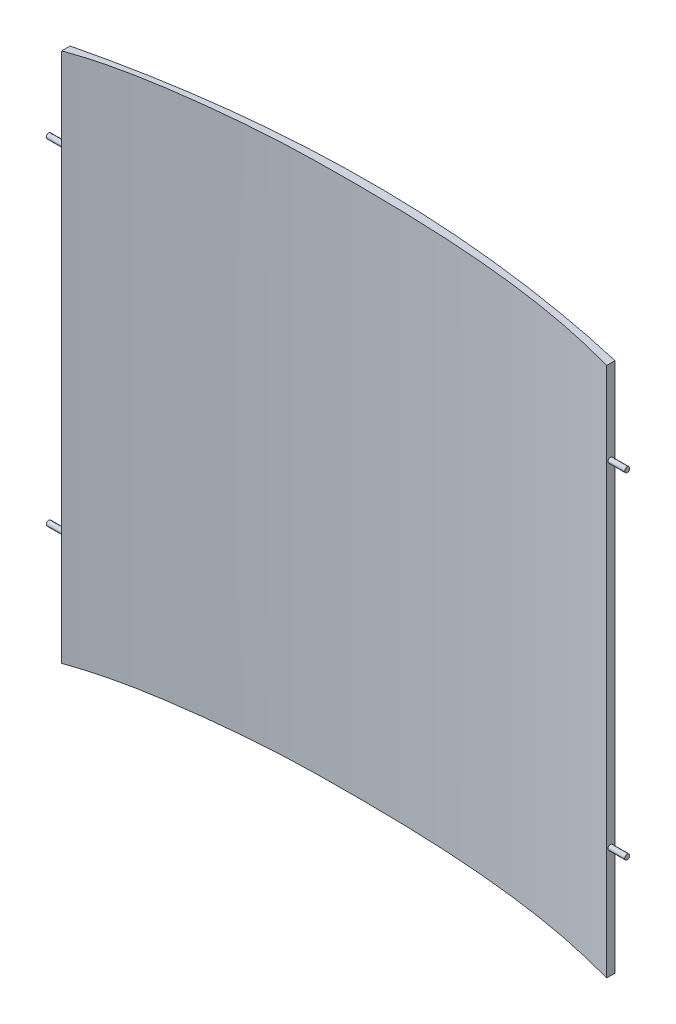
ISO-10303-21;
HEADER;
FILE_DESCRIPTION(('STEP AP214'),'2;1');
FILE_NAME('part.step','',(''),(''),'','','');
FILE_SCHEMA(('AUTOMOTIVE_DESIGN { 1 0 10303 214 1 1 1 1 }'));
ENDSEC;
DATA;
#1=APPLICATION_CONTEXT('core data for automotive mechanical design processes');
#2=APPLICATION_PROTOCOL_DEFINITION('international standard','automotive_design',2000,#1);
#3=PRODUCT_CONTEXT('',#1,'mechanical');
#4=PRODUCT('Part','Part','',(#3));
#5=PRODUCT_RELATED_PRODUCT_CATEGORY('part','',(#4));
#6=PRODUCT_DEFINITION_FORMATION('','',#4);
#7=PRODUCT_DEFINITION_CONTEXT('part definition',#1,'design');
#8=PRODUCT_DEFINITION('design','',#6,#7);
#9=PRODUCT_DEFINITION_SHAPE('','',#8);
#10=(LENGTH_UNIT() NAMED_UNIT(*) SI_UNIT(.MILLI.,.METRE.));
#11=(NAMED_UNIT(*) PLANE_ANGLE_UNIT() SI_UNIT($,.RADIAN.));
#12=(NAMED_UNIT(*) SI_UNIT($,.STERADIAN.) SOLID_ANGLE_UNIT());
#13=UNCERTAINTY_MEASURE_WITH_UNIT(LENGTH_MEASURE(1.E-05),#10,'distance_accuracy_value','');
#14=(GEOMETRIC_REPRESENTATION_CONTEXT(3) GLOBAL_UNCERTAINTY_ASSIGNED_CONTEXT((#13)) GLOBAL_UNIT_ASSIGNED_CONTEXT((#10,
#11,#12)) REPRESENTATION_CONTEXT('',''));
#15=CARTESIAN_POINT('',(0.,0.,0.));
#16=DIRECTION('',(0.,0.,1.));
#17=DIRECTION('',(1.,0.,0.));
#18=AXIS2_PLACEMENT_3D('',#15,#16,#17);
#19=CARTESIAN_POINT('',(325.,-316.370423025,100.));
#20=DIRECTION('',(-1.,0.,0.));
#21=DIRECTION('',(0.,0.,1.));
#22=AXIS2_PLACEMENT_3D('',#19,#20,#21);
#23=PLANE('',#22);
#24=CARTESIAN_POINT('',(325.,-183.629576975,55.4616485957822));
#25=DIRECTION('',(-1.,0.,0.));
#26=DIRECTION('',(0.,0.,1.));
#27=AXIS2_PLACEMENT_3D('',#24,#25,#26);
#28=CIRCLE('',#27,3.);
#29=CARTESIAN_POINT('',(325.,-183.629576975,58.4616485957822));
#30=VERTEX_POINT('',#29);
#31=EDGE_CURVE('E11',#30,#30,#28,.F.);
#32=ORIENTED_EDGE('',*,*,#31,.F.);
#33=EDGE_LOOP('',(#32));
#34=FACE_BOUND('',#33,.T.);
#35=CARTESIAN_POINT('',(325.,216.370423025,55.4616485957822));
#36=DIRECTION('',(-1.,0.,0.));
#37=DIRECTION('',(0.,0.,1.));
#38=AXIS2_PLACEMENT_3D('',#35,#36,#37);
#39=CIRCLE('',#38,3.);
#40=CARTESIAN_POINT('',(325.,216.370423025,58.4616485957822));
#41=VERTEX_POINT('',#40);
#42=EDGE_CURVE('E41',#41,#41,#39,.F.);
#43=ORIENTED_EDGE('',*,*,#42,.F.);
#44=EDGE_LOOP('',(#43));
#45=FACE_BOUND('',#44,.T.);
#46=DIRECTION('',(0.,0.,-1.));
#47=VECTOR('',#46,1.);
#48=CARTESIAN_POINT('',(325.,316.370423025,100.));
#49=LINE('',#48,#47);
#50=CARTESIAN_POINT('',(325.,316.370423025,60.0018684780457));
#51=VERTEX_POINT('',#50);
#52=CARTESIAN_POINT('',(325.,316.370423025,50.));
#53=VERTEX_POINT('',#52);
#54=EDGE_CURVE('E94',#51,#53,#49,.T.);
#55=ORIENTED_EDGE('',*,*,#54,.F.);
#56=DIRECTION('',(0.,1.,0.));
#57=VECTOR('',#56,1.);
#58=CARTESIAN_POINT('',(325.,-410.629576975,60.0018684780457));
#59=LINE('',#58,#57);
#60=CARTESIAN_POINT('',(325.,-316.370423025,60.0018684780457));
#61=VERTEX_POINT('',#60);
#62=EDGE_CURVE('E75',#61,#51,#59,.T.);
#63=ORIENTED_EDGE('',*,*,#62,.F.);
#64=DIRECTION('',(0.,0.,-1.));
#65=VECTOR('',#64,1.);
#66=CARTESIAN_POINT('',(325.,-316.370423025,100.));
#67=LINE('',#66,#65);
#68=CARTESIAN_POINT('',(325.,-316.370423025,50.));
#69=VERTEX_POINT('',#68);
#70=EDGE_CURVE('E98',#61,#69,#67,.T.);
#71=ORIENTED_EDGE('',*,*,#70,.T.);
#72=DIRECTION('',(0.,1.,0.));
#73=VECTOR('',#72,1.);
#74=CARTESIAN_POINT('',(325.,-410.629576975,50.));
#75=LINE('',#74,#73);
#76=EDGE_CURVE('E56',#69,#53,#75,.T.);
#77=ORIENTED_EDGE('',*,*,#76,.T.);
#78=EDGE_LOOP('',(#55,#63,#71,#77));
#79=FACE_BOUND('',#78,.T.);
#80=ADVANCED_FACE('F34',(#34,#45,#79),#23,.F.);
#81=CARTESIAN_POINT('',(-325.,316.370423025,100.));
#82=DIRECTION('',(0.,-1.,0.));
#83=DIRECTION('',(0.,0.,-1.));
#84=AXIS2_PLACEMENT_3D('',#81,#82,#83);
#85=PLANE('',#84);
#86=DIRECTION('',(0.,0.,-1.));
#87=VECTOR('',#86,1.);
#88=CARTESIAN_POINT('',(-325.,316.370423025,100.));
#89=LINE('',#88,#87);
#90=CARTESIAN_POINT('',(-325.,316.370423025,60.0018684780457));
#91=VERTEX_POINT('',#90);
#92=CARTESIAN_POINT('',(-325.,316.370423025,50.));
#93=VERTEX_POINT('',#92);
#94=EDGE_CURVE('E87',#91,#93,#89,.T.);
#95=ORIENTED_EDGE('',*,*,#94,.F.);
#96=CARTESIAN_POINT('',(325.,316.370423025,60.0018684780457));
#97=CARTESIAN_POINT('',(213.037551739842,316.370423025,28.371598233179));
#98=CARTESIAN_POINT('',(68.945530871776,316.370423025,20.464192827032));
#99=CARTESIAN_POINT('',(-108.286436324766,316.370423025,22.7976463773087));
#100=CARTESIAN_POINT('',(-211.551334209735,316.370423025,32.9618529071094));
#101=CARTESIAN_POINT('',(-285.720204311564,316.370423025,45.9172878808449));
#102=CARTESIAN_POINT('',(-325.,316.370423025,60.0018684780457));
#103=B_SPLINE_CURVE_WITH_KNOTS('',3,(#96,#97,#98,#99,#100,#101,#102),.UNSPECIFIED.,.F.,.F.,(4,1,
1,1,4),(0.,0.525910325284448,0.657486971917113,0.809723302599049,1.),.UNSPECIFIED.);
#104=EDGE_CURVE('E72',#51,#91,#103,.T.);
#105=ORIENTED_EDGE('',*,*,#104,.F.);
#106=ORIENTED_EDGE('',*,*,#54,.T.);
#107=CARTESIAN_POINT('',(-325.,316.370423025,50.0000000000001));
#108=CARTESIAN_POINT('',(-8.16154451747867,316.370423025,-26.4038966994883));
#109=CARTESIAN_POINT('',(325.,316.370423025,50.));
#110=B_SPLINE_CURVE_WITH_KNOTS('',2,(#107,#108,#109),.UNSPECIFIED.,.F.,.F.,(3,3),(0.,1.),.UNSPECIFIED.);
#111=EDGE_CURVE('E93',#93,#53,#110,.T.);
#112=ORIENTED_EDGE('',*,*,#111,.F.);
#113=EDGE_LOOP('',(#95,#105,#106,#112));
#114=FACE_BOUND('',#113,.T.);
#115=ADVANCED_FACE('F92',(#114),#85,.F.);
#116=CARTESIAN_POINT('',(-325.,-316.370423025,100.));
#117=DIRECTION('',(1.,0.,0.));
#118=DIRECTION('',(0.,0.,-1.));
#119=AXIS2_PLACEMENT_3D('',#116,#117,#118);
#120=PLANE('',#119);
#121=CARTESIAN_POINT('',(-325.,-183.629576975,55.4616485957822));
#122=DIRECTION('',(1.,0.,0.));
#123=DIRECTION('',(0.,0.,-1.));
#124=AXIS2_PLACEMENT_3D('',#121,#122,#123);
#125=CIRCLE('',#124,3.);
#126=CARTESIAN_POINT('',(-325.,-183.629576975,52.4616485957822));
#127=VERTEX_POINT('',#126);
#128=EDGE_CURVE('E274',#127,#127,#125,.T.);
#129=ORIENTED_EDGE('',*,*,#128,.T.);
#130=EDGE_LOOP('',(#129));
#131=FACE_BOUND('',#130,.T.);
#132=CARTESIAN_POINT('',(-325.,216.370423025,55.4616485957822));
#133=DIRECTION('',(1.,0.,0.));
#134=DIRECTION('',(0.,0.,-1.));
#135=AXIS2_PLACEMENT_3D('',#132,#133,#134);
#136=CIRCLE('',#135,3.);
#137=CARTESIAN_POINT('',(-325.,216.370423025,52.4616485957822));
#138=VERTEX_POINT('',#137);
#139=EDGE_CURVE('E273',#138,#138,#136,.T.);
#140=ORIENTED_EDGE('',*,*,#139,.T.);
#141=EDGE_LOOP('',(#140));
#142=FACE_BOUND('',#141,.T.);
#143=DIRECTION('',(0.,0.,-1.));
#144=VECTOR('',#143,1.);
#145=CARTESIAN_POINT('',(-325.,-316.370423025,100.));
#146=LINE('',#145,#144);
#147=CARTESIAN_POINT('',(-325.,-316.370423025,60.0018684780457));
#148=VERTEX_POINT('',#147);
#149=CARTESIAN_POINT('',(-325.,-316.370423025,50.));
#150=VERTEX_POINT('',#149);
#151=EDGE_CURVE('E89',#148,#150,#146,.T.);
#152=ORIENTED_EDGE('',*,*,#151,.F.);
#153=DIRECTION('',(0.,1.,0.));
#154=VECTOR('',#153,1.);
#155=CARTESIAN_POINT('',(-325.,-410.629576975,60.0018684780457));
#156=LINE('',#155,#154);
#157=EDGE_CURVE('E48',#148,#91,#156,.T.);
#158=ORIENTED_EDGE('',*,*,#157,.T.);
#159=ORIENTED_EDGE('',*,*,#94,.T.);
#160=DIRECTION('',(0.,1.,0.));
#161=VECTOR('',#160,1.);
#162=CARTESIAN_POINT('',(-325.,-410.629576975,50.));
#163=LINE('',#162,#161);
#164=EDGE_CURVE('E124',#150,#93,#163,.T.);
#165=ORIENTED_EDGE('',*,*,#164,.F.);
#166=EDGE_LOOP('',(#152,#158,#159,#165));
#167=FACE_BOUND('',#166,.T.);
#168=ADVANCED_FACE('F85',(#131,#142,#167),#120,.F.);
#169=CARTESIAN_POINT('',(-325.,-316.370423025,100.));
#170=DIRECTION('',(0.,1.,0.));
#171=DIRECTION('',(0.,0.,1.));
#172=AXIS2_PLACEMENT_3D('',#169,#170,#171);
#173=PLANE('',#172);
#174=ORIENTED_EDGE('',*,*,#70,.F.);
#175=CARTESIAN_POINT('',(325.,-316.370423025,60.0018684780457));
#176=CARTESIAN_POINT('',(213.037551739842,-316.370423025,28.371598233179));
#177=CARTESIAN_POINT('',(68.945530871776,-316.370423025,20.464192827032));
#178=CARTESIAN_POINT('',(-108.286436324766,-316.370423025,22.7976463773087));
#179=CARTESIAN_POINT('',(-211.551334209735,-316.370423025,32.9618529071094));
#180=CARTESIAN_POINT('',(-285.720204311564,-316.370423025,45.9172878808449));
#181=CARTESIAN_POINT('',(-325.,-316.370423025,60.0018684780457));
#182=B_SPLINE_CURVE_WITH_KNOTS('',3,(#175,#176,#177,#178,#179,#180,#181),.UNSPECIFIED.,.F.,.F.,
(4,1,1,1,4),(0.,0.525910325284448,0.657486971917113,0.809723302599049,1.),.UNSPECIFIED.);
#183=EDGE_CURVE('E105',#61,#148,#182,.T.);
#184=ORIENTED_EDGE('',*,*,#183,.T.);
#185=ORIENTED_EDGE('',*,*,#151,.T.);
#186=CARTESIAN_POINT('',(-325.,-316.370423025,50.0000000000001));
#187=CARTESIAN_POINT('',(-8.16154451747867,-316.370423025,-26.4038966994883));
#188=CARTESIAN_POINT('',(325.,-316.370423025,50.));
#189=B_SPLINE_CURVE_WITH_KNOTS('',2,(#186,#187,#188),.UNSPECIFIED.,.F.,.F.,(3,3),(0.,1.),.UNSPECIFIED.);
#190=EDGE_CURVE('E96',#150,#69,#189,.T.);
#191=ORIENTED_EDGE('',*,*,#190,.T.);
#192=EDGE_LOOP('',(#174,#184,#185,#191));
#193=FACE_BOUND('',#192,.T.);
#194=ADVANCED_FACE('F146',(#193),#173,.F.);
#195=CARTESIAN_POINT('',(-325.,-410.629576975,50.0000000000001));
#196=CARTESIAN_POINT('',(-8.16154451747867,-410.629576975,-26.4038966994883));
#197=CARTESIAN_POINT('',(325.,-410.629576975,50.));
#198=B_SPLINE_CURVE_WITH_KNOTS('',2,(#195,#196,#197),.UNSPECIFIED.,.F.,.F.,(3,3),(0.,1.),.UNSPECIFIED.);
#199=DIRECTION('',(0.,1.,0.));
#200=VECTOR('',#199,1.);
#201=SURFACE_OF_LINEAR_EXTRUSION('',#198,#200);
#202=ORIENTED_EDGE('',*,*,#164,.T.);
#203=ORIENTED_EDGE('',*,*,#111,.T.);
#204=ORIENTED_EDGE('',*,*,#76,.F.);
#205=ORIENTED_EDGE('',*,*,#190,.F.);
#206=EDGE_LOOP('',(#202,#203,#204,#205));
#207=FACE_BOUND('',#206,.T.);
#208=ADVANCED_FACE('F142',(#207),#201,.F.);
#209=CARTESIAN_POINT('',(325.,-410.629576975,60.0018684780457));
#210=CARTESIAN_POINT('',(213.037551739842,-410.629576975,28.371598233179));
#211=CARTESIAN_POINT('',(68.945530871776,-410.629576975,20.464192827032));
#212=CARTESIAN_POINT('',(-108.286436324766,-410.629576975,22.7976463773087));
#213=CARTESIAN_POINT('',(-211.551334209735,-410.629576975,32.9618529071094));
#214=CARTESIAN_POINT('',(-285.720204311564,-410.629576975,45.9172878808449));
#215=CARTESIAN_POINT('',(-325.,-410.629576975,60.0018684780457));
#216=B_SPLINE_CURVE_WITH_KNOTS('',3,(#209,#210,#211,#212,#213,#214,#215),.UNSPECIFIED.,.F.,.F.,
(4,1,1,1,4),(0.,0.525910325284448,0.657486971917113,0.809723302599049,1.),.UNSPECIFIED.);
#217=DIRECTION('',(0.,1.,0.));
#218=VECTOR('',#217,1.);
#219=SURFACE_OF_LINEAR_EXTRUSION('',#216,#218);
#220=ORIENTED_EDGE('',*,*,#62,.T.);
#221=ORIENTED_EDGE('',*,*,#104,.T.);
#222=ORIENTED_EDGE('',*,*,#157,.F.);
#223=ORIENTED_EDGE('',*,*,#183,.F.);
#224=EDGE_LOOP('',(#220,#221,#222,#223));
#225=FACE_BOUND('',#224,.T.);
#226=ADVANCED_FACE('F73',(#225),#219,.F.);
#227=CARTESIAN_POINT('',(345.,216.370423025,55.4616485957822));
#228=DIRECTION('',(-1.,0.,0.));
#229=DIRECTION('',(0.,0.,1.));
#230=AXIS2_PLACEMENT_3D('',#227,#228,#229);
#231=CYLINDRICAL_SURFACE('',#230,3.);
#232=CARTESIAN_POINT('',(345.,216.370423025,55.4616485957822));
#233=DIRECTION('',(1.,0.,0.));
#234=DIRECTION('',(0.,0.,-1.));
#235=AXIS2_PLACEMENT_3D('',#232,#233,#234);
#236=CIRCLE('',#235,3.);
#237=CARTESIAN_POINT('',(345.,216.370423025,52.4616485957822));
#238=VERTEX_POINT('',#237);
#239=EDGE_CURVE('E80',#238,#238,#236,.T.);
#240=ORIENTED_EDGE('',*,*,#239,.F.);
#241=EDGE_LOOP('',(#240));
#242=FACE_BOUND('',#241,.T.);
#243=ORIENTED_EDGE('',*,*,#42,.T.);
#244=EDGE_LOOP('',(#243));
#245=FACE_BOUND('',#244,.T.);
#246=ADVANCED_FACE('F117',(#242,#245),#231,.T.);
#247=CARTESIAN_POINT('',(345.,216.370423025,55.4616485957822));
#248=DIRECTION('',(1.,0.,0.));
#249=DIRECTION('',(0.,0.,-1.));
#250=AXIS2_PLACEMENT_3D('',#247,#248,#249);
#251=PLANE('',#250);
#252=ORIENTED_EDGE('',*,*,#239,.T.);
#253=EDGE_LOOP('',(#252));
#254=FACE_BOUND('',#253,.T.);
#255=ADVANCED_FACE('F184',(#254),#251,.T.);
#256=CARTESIAN_POINT('',(345.,-183.629576975,55.4616485957822));
#257=DIRECTION('',(-1.,0.,0.));
#258=DIRECTION('',(0.,0.,1.));
#259=AXIS2_PLACEMENT_3D('',#256,#257,#258);
#260=CYLINDRICAL_SURFACE('',#259,3.);
#261=CARTESIAN_POINT('',(345.,-183.629576975,55.4616485957822));
#262=DIRECTION('',(1.,0.,0.));
#263=DIRECTION('',(0.,0.,-1.));
#264=AXIS2_PLACEMENT_3D('',#261,#262,#263);
#265=CIRCLE('',#264,3.);
#266=CARTESIAN_POINT('',(345.,-183.629576975,52.4616485957822));
#267=VERTEX_POINT('',#266);
#268=EDGE_CURVE('E283',#267,#267,#265,.T.);
#269=ORIENTED_EDGE('',*,*,#268,.F.);
#270=EDGE_LOOP('',(#269));
#271=FACE_BOUND('',#270,.T.);
#272=ORIENTED_EDGE('',*,*,#31,.T.);
#273=EDGE_LOOP('',(#272));
#274=FACE_BOUND('',#273,.T.);
#275=ADVANCED_FACE('F191',(#271,#274),#260,.T.);
#276=CARTESIAN_POINT('',(345.,-183.629576975,55.4616485957822));
#277=DIRECTION('',(1.,0.,0.));
#278=DIRECTION('',(0.,0.,-1.));
#279=AXIS2_PLACEMENT_3D('',#276,#277,#278);
#280=PLANE('',#279);
#281=ORIENTED_EDGE('',*,*,#268,.T.);
#282=EDGE_LOOP('',(#281));
#283=FACE_BOUND('',#282,.T.);
#284=ADVANCED_FACE('F199',(#283),#280,.T.);
#285=CARTESIAN_POINT('',(-345.,216.370423025,55.4616485957822));
#286=DIRECTION('',(1.,0.,0.));
#287=DIRECTION('',(0.,0.,-1.));
#288=AXIS2_PLACEMENT_3D('',#285,#286,#287);
#289=CYLINDRICAL_SURFACE('',#288,3.);
#290=CARTESIAN_POINT('',(-345.,216.370423025,55.4616485957822));
#291=DIRECTION('',(1.,0.,0.));
#292=DIRECTION('',(0.,0.,-1.));
#293=AXIS2_PLACEMENT_3D('',#290,#291,#292);
#294=CIRCLE('',#293,3.);
#295=CARTESIAN_POINT('',(-345.,216.370423025,52.4616485957822));
#296=VERTEX_POINT('',#295);
#297=EDGE_CURVE('E277',#296,#296,#294,.T.);
#298=ORIENTED_EDGE('',*,*,#297,.T.);
#299=EDGE_LOOP('',(#298));
#300=FACE_BOUND('',#299,.T.);
#301=ORIENTED_EDGE('',*,*,#139,.F.);
#302=EDGE_LOOP('',(#301));
#303=FACE_BOUND('',#302,.T.);
#304=ADVANCED_FACE('F206',(#300,#303),#289,.T.);
#305=CARTESIAN_POINT('',(-345.,216.370423025,55.4616485957822));
#306=DIRECTION('',(-1.,0.,0.));
#307=DIRECTION('',(0.,0.,-1.));
#308=AXIS2_PLACEMENT_3D('',#305,#306,#307);
#309=PLANE('',#308);
#310=ORIENTED_EDGE('',*,*,#297,.F.);
#311=EDGE_LOOP('',(#310));
#312=FACE_BOUND('',#311,.T.);
#313=ADVANCED_FACE('F213',(#312),#309,.T.);
#314=CARTESIAN_POINT('',(-345.,-183.629576975,55.4616485957822));
#315=DIRECTION('',(1.,0.,0.));
#316=DIRECTION('',(0.,0.,-1.));
#317=AXIS2_PLACEMENT_3D('',#314,#315,#316);
#318=CYLINDRICAL_SURFACE('',#317,3.);
#319=CARTESIAN_POINT('',(-345.,-183.629576975,55.4616485957822));
#320=DIRECTION('',(1.,0.,0.));
#321=DIRECTION('',(0.,0.,-1.));
#322=AXIS2_PLACEMENT_3D('',#319,#320,#321);
#323=CIRCLE('',#322,3.);
#324=CARTESIAN_POINT('',(-345.,-183.629576975,52.4616485957822));
#325=VERTEX_POINT('',#324);
#326=EDGE_CURVE('E272',#325,#325,#323,.T.);
#327=ORIENTED_EDGE('',*,*,#326,.T.);
#328=EDGE_LOOP('',(#327));
#329=FACE_BOUND('',#328,.T.);
#330=ORIENTED_EDGE('',*,*,#128,.F.);
#331=EDGE_LOOP('',(#330));
#332=FACE_BOUND('',#331,.T.);
#333=ADVANCED_FACE('F221',(#329,#332),#318,.T.);
#334=CARTESIAN_POINT('',(-345.,-183.629576975,55.4616485957822));
#335=DIRECTION('',(-1.,0.,0.));
#336=DIRECTION('',(0.,0.,-1.));
#337=AXIS2_PLACEMENT_3D('',#334,#335,#336);
#338=PLANE('',#337);
#339=ORIENTED_EDGE('',*,*,#326,.F.);
#340=EDGE_LOOP('',(#339));
#341=FACE_BOUND('',#340,.T.);
#342=ADVANCED_FACE('F229',(#341),#338,.T.);
#343=CLOSED_SHELL('',(#80,#115,#168,#194,#208,#226,#246,#255,#275,#284,#304,#313,#333,#342));
#344=MANIFOLD_SOLID_BREP('B2',#343);
#345=ADVANCED_BREP_SHAPE_REPRESENTATION('',(#18,#344),#14);
#346=SHAPE_DEFINITION_REPRESENTATION(#9,#345);
ENDSEC;
END-ISO-10303-21;
